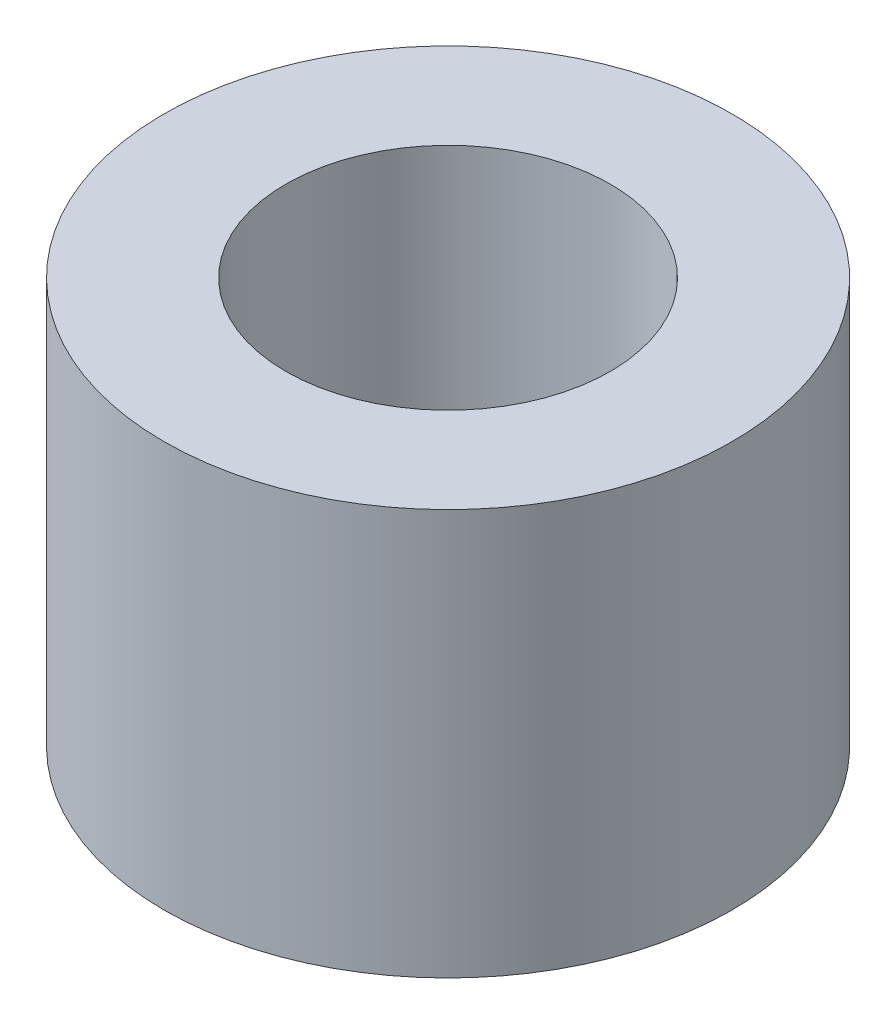
ISO-10303-21;
HEADER;
FILE_DESCRIPTION(('STEP AP214'),'2;1');
FILE_NAME('part.step','',(''),(''),'','','');
FILE_SCHEMA(('AUTOMOTIVE_DESIGN { 1 0 10303 214 1 1 1 1 }'));
ENDSEC;
DATA;
#1=APPLICATION_CONTEXT('core data for automotive mechanical design processes');
#2=APPLICATION_PROTOCOL_DEFINITION('international standard','automotive_design',2000,#1);
#3=PRODUCT_CONTEXT('',#1,'mechanical');
#4=PRODUCT('Part','Part','',(#3));
#5=PRODUCT_RELATED_PRODUCT_CATEGORY('part','',(#4));
#6=PRODUCT_DEFINITION_FORMATION('','',#4);
#7=PRODUCT_DEFINITION_CONTEXT('part definition',#1,'design');
#8=PRODUCT_DEFINITION('design','',#6,#7);
#9=PRODUCT_DEFINITION_SHAPE('','',#8);
#10=(LENGTH_UNIT() NAMED_UNIT(*) SI_UNIT(.MILLI.,.METRE.));
#11=(NAMED_UNIT(*) PLANE_ANGLE_UNIT() SI_UNIT($,.RADIAN.));
#12=(NAMED_UNIT(*) SI_UNIT($,.STERADIAN.) SOLID_ANGLE_UNIT());
#13=UNCERTAINTY_MEASURE_WITH_UNIT(LENGTH_MEASURE(1.E-05),#10,'distance_accuracy_value','');
#14=(GEOMETRIC_REPRESENTATION_CONTEXT(3) GLOBAL_UNCERTAINTY_ASSIGNED_CONTEXT((#13)) GLOBAL_UNIT_ASSIGNED_CONTEXT((#10,
#11,#12)) REPRESENTATION_CONTEXT('',''));
#15=CARTESIAN_POINT('',(0.,0.,0.));
#16=DIRECTION('',(0.,0.,1.));
#17=DIRECTION('',(1.,0.,0.));
#18=AXIS2_PLACEMENT_3D('',#15,#16,#17);
#19=CARTESIAN_POINT('',(0.,5.,0.));
#20=DIRECTION('',(0.,1.,0.));
#21=DIRECTION('',(0.,0.,1.));
#22=AXIS2_PLACEMENT_3D('',#19,#20,#21);
#23=PLANE('',#22);
#24=CARTESIAN_POINT('',(0.,5.,0.));
#25=DIRECTION('',(0.,1.,0.));
#26=DIRECTION('',(0.,0.,1.));
#27=AXIS2_PLACEMENT_3D('',#24,#25,#26);
#28=CIRCLE('',#27,3.5);
#29=CARTESIAN_POINT('',(0.,5.,3.5));
#30=VERTEX_POINT('',#29);
#31=EDGE_CURVE('E10',#30,#30,#28,.T.);
#32=ORIENTED_EDGE('',*,*,#31,.T.);
#33=EDGE_LOOP('',(#32));
#34=FACE_BOUND('',#33,.T.);
#35=CARTESIAN_POINT('',(0.,5.,0.));
#36=DIRECTION('',(0.,1.,0.));
#37=DIRECTION('',(0.,0.,1.));
#38=AXIS2_PLACEMENT_3D('',#35,#36,#37);
#39=CIRCLE('',#38,2.);
#40=CARTESIAN_POINT('',(0.,5.,2.));
#41=VERTEX_POINT('',#40);
#42=EDGE_CURVE('E42',#41,#41,#39,.T.);
#43=ORIENTED_EDGE('',*,*,#42,.F.);
#44=EDGE_LOOP('',(#43));
#45=FACE_BOUND('',#44,.T.);
#46=ADVANCED_FACE('F31',(#34,#45),#23,.T.);
#47=CARTESIAN_POINT('',(0.,0.,0.));
#48=DIRECTION('',(0.,1.,0.));
#49=DIRECTION('',(0.,0.,1.));
#50=AXIS2_PLACEMENT_3D('',#47,#48,#49);
#51=PLANE('',#50);
#52=CARTESIAN_POINT('',(0.,0.,0.));
#53=DIRECTION('',(0.,1.,0.));
#54=DIRECTION('',(0.,0.,1.));
#55=AXIS2_PLACEMENT_3D('',#52,#53,#54);
#56=CIRCLE('',#55,3.5);
#57=CARTESIAN_POINT('',(0.,0.,3.5));
#58=VERTEX_POINT('',#57);
#59=EDGE_CURVE('E35',#58,#58,#56,.T.);
#60=ORIENTED_EDGE('',*,*,#59,.F.);
#61=EDGE_LOOP('',(#60));
#62=FACE_BOUND('',#61,.T.);
#63=CARTESIAN_POINT('',(0.,0.,0.));
#64=DIRECTION('',(0.,1.,0.));
#65=DIRECTION('',(0.,0.,1.));
#66=AXIS2_PLACEMENT_3D('',#63,#64,#65);
#67=CIRCLE('',#66,2.);
#68=CARTESIAN_POINT('',(0.,0.,2.));
#69=VERTEX_POINT('',#68);
#70=EDGE_CURVE('E44',#69,#69,#67,.T.);
#71=ORIENTED_EDGE('',*,*,#70,.T.);
#72=EDGE_LOOP('',(#71));
#73=FACE_BOUND('',#72,.T.);
#74=ADVANCED_FACE('F54',(#62,#73),#51,.F.);
#75=CARTESIAN_POINT('',(0.,5.,0.));
#76=DIRECTION('',(0.,-1.,0.));
#77=DIRECTION('',(0.,0.,-1.));
#78=AXIS2_PLACEMENT_3D('',#75,#76,#77);
#79=CYLINDRICAL_SURFACE('',#78,3.5);
#80=ORIENTED_EDGE('',*,*,#31,.F.);
#81=EDGE_LOOP('',(#80));
#82=FACE_BOUND('',#81,.T.);
#83=ORIENTED_EDGE('',*,*,#59,.T.);
#84=EDGE_LOOP('',(#83));
#85=FACE_BOUND('',#84,.T.);
#86=ADVANCED_FACE('F33',(#82,#85),#79,.T.);
#87=CARTESIAN_POINT('',(0.,5.,0.));
#88=DIRECTION('',(0.,-1.,0.));
#89=DIRECTION('',(0.,0.,-1.));
#90=AXIS2_PLACEMENT_3D('',#87,#88,#89);
#91=CYLINDRICAL_SURFACE('',#90,2.);
#92=ORIENTED_EDGE('',*,*,#42,.T.);
#93=EDGE_LOOP('',(#92));
#94=FACE_BOUND('',#93,.T.);
#95=ORIENTED_EDGE('',*,*,#70,.F.);
#96=EDGE_LOOP('',(#95));
#97=FACE_BOUND('',#96,.T.);
#98=ADVANCED_FACE('F50',(#94,#97),#91,.F.);
#99=CLOSED_SHELL('',(#46,#74,#86,#98));
#100=MANIFOLD_SOLID_BREP('B2',#99);
#101=ADVANCED_BREP_SHAPE_REPRESENTATION('',(#18,#100),#14);
#102=SHAPE_DEFINITION_REPRESENTATION(#9,#101);
ENDSEC;
END-ISO-10303-21;
